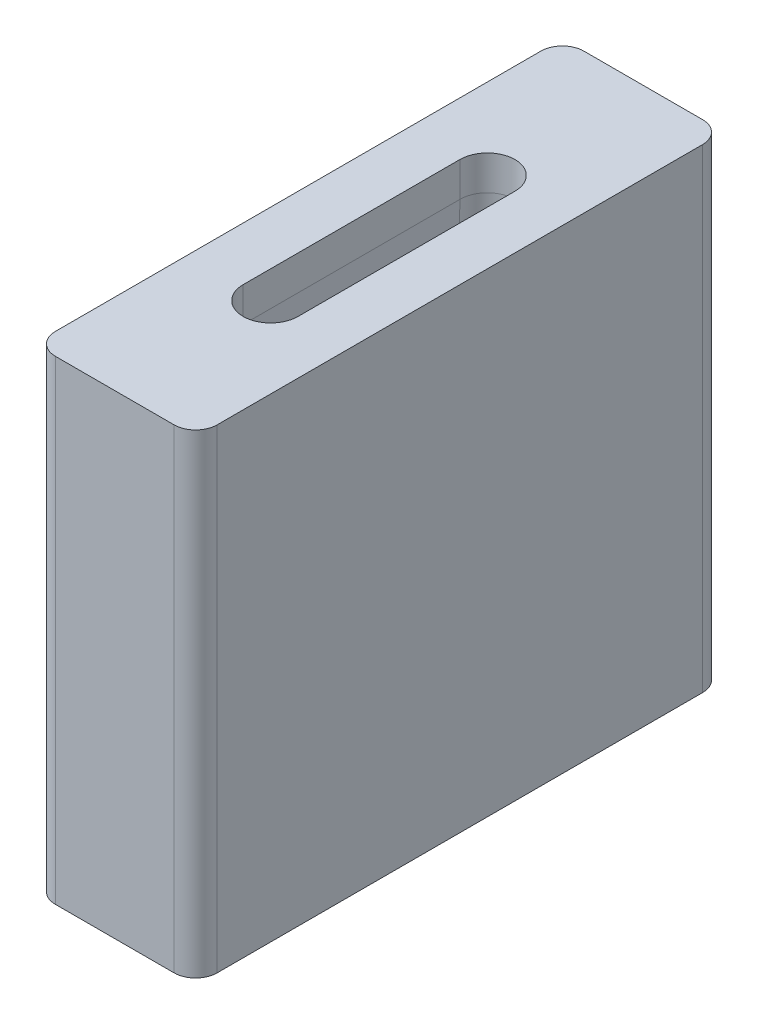
ISO-10303-21;
HEADER;
FILE_DESCRIPTION(('STEP AP214'),'2;1');
FILE_NAME('part.step','',(''),(''),'','','');
FILE_SCHEMA(('AUTOMOTIVE_DESIGN { 1 0 10303 214 1 1 1 1 }'));
ENDSEC;
DATA;
#1=APPLICATION_CONTEXT('core data for automotive mechanical design processes');
#2=APPLICATION_PROTOCOL_DEFINITION('international standard','automotive_design',2000,#1);
#3=PRODUCT_CONTEXT('',#1,'mechanical');
#4=PRODUCT('Part','Part','',(#3));
#5=PRODUCT_RELATED_PRODUCT_CATEGORY('part','',(#4));
#6=PRODUCT_DEFINITION_FORMATION('','',#4);
#7=PRODUCT_DEFINITION_CONTEXT('part definition',#1,'design');
#8=PRODUCT_DEFINITION('design','',#6,#7);
#9=PRODUCT_DEFINITION_SHAPE('','',#8);
#10=(LENGTH_UNIT() NAMED_UNIT(*) SI_UNIT(.MILLI.,.METRE.));
#11=(NAMED_UNIT(*) PLANE_ANGLE_UNIT() SI_UNIT($,.RADIAN.));
#12=(NAMED_UNIT(*) SI_UNIT($,.STERADIAN.) SOLID_ANGLE_UNIT());
#13=UNCERTAINTY_MEASURE_WITH_UNIT(LENGTH_MEASURE(1.E-05),#10,'distance_accuracy_value','');
#14=(GEOMETRIC_REPRESENTATION_CONTEXT(3) GLOBAL_UNCERTAINTY_ASSIGNED_CONTEXT((#13)) GLOBAL_UNIT_ASSIGNED_CONTEXT((#10,
#11,#12)) REPRESENTATION_CONTEXT('',''));
#15=CARTESIAN_POINT('',(0.,0.,0.));
#16=DIRECTION('',(0.,0.,1.));
#17=DIRECTION('',(1.,0.,0.));
#18=AXIS2_PLACEMENT_3D('',#15,#16,#17);
#19=CARTESIAN_POINT('',(0.,-44.001,10.05));
#20=DIRECTION('',(0.,1.,0.));
#21=DIRECTION('',(0.,0.,1.));
#22=AXIS2_PLACEMENT_3D('',#19,#20,#21);
#23=CYLINDRICAL_SURFACE('',#22,2.55);
#24=CARTESIAN_POINT('',(0.,-3.2,10.05));
#25=DIRECTION('',(0.,1.,0.));
#26=DIRECTION('',(-1.,0.,0.));
#27=AXIS2_PLACEMENT_3D('',#24,#25,#26);
#28=CIRCLE('',#27,2.55);
#29=CARTESIAN_POINT('',(-2.55,-3.2,10.05));
#30=VERTEX_POINT('',#29);
#31=CARTESIAN_POINT('',(2.55,-3.20000000000076,10.05));
#32=VERTEX_POINT('',#31);
#33=EDGE_CURVE('E75',#30,#32,#28,.T.);
#34=ORIENTED_EDGE('',*,*,#33,.F.);
#35=DIRECTION('',(0.,1.,0.));
#36=VECTOR('',#35,1.);
#37=CARTESIAN_POINT('',(-2.55,-44.001,10.05));
#38=LINE('',#37,#36);
#39=CARTESIAN_POINT('',(-2.55,0.,10.05));
#40=VERTEX_POINT('',#39);
#41=EDGE_CURVE('E238',#30,#40,#38,.T.);
#42=ORIENTED_EDGE('',*,*,#41,.T.);
#43=CARTESIAN_POINT('',(0.,0.,10.05));
#44=DIRECTION('',(0.,1.,0.));
#45=DIRECTION('',(0.,0.,1.));
#46=AXIS2_PLACEMENT_3D('',#43,#44,#45);
#47=CIRCLE('',#46,2.55);
#48=CARTESIAN_POINT('',(2.55,0.,10.05));
#49=VERTEX_POINT('',#48);
#50=EDGE_CURVE('E224',#40,#49,#47,.T.);
#51=ORIENTED_EDGE('',*,*,#50,.T.);
#52=DIRECTION('',(0.,1.,0.));
#53=VECTOR('',#52,1.);
#54=CARTESIAN_POINT('',(2.55,-44.001,10.05));
#55=LINE('',#54,#53);
#56=EDGE_CURVE('E237',#32,#49,#55,.T.);
#57=ORIENTED_EDGE('',*,*,#56,.F.);
#58=EDGE_LOOP('',(#34,#42,#51,#57));
#59=FACE_BOUND('',#58,.T.);
#60=ADVANCED_FACE('F51',(#59),#23,.F.);
#61=CARTESIAN_POINT('',(-2.55,-44.001,10.05));
#62=DIRECTION('',(-1.,0.,0.));
#63=DIRECTION('',(0.,0.,1.));
#64=AXIS2_PLACEMENT_3D('',#61,#62,#63);
#65=PLANE('',#64);
#66=DIRECTION('',(0.,0.,1.));
#67=VECTOR('',#66,1.);
#68=CARTESIAN_POINT('',(-2.55000000000001,-3.2,-10.05));
#69=LINE('',#68,#67);
#70=CARTESIAN_POINT('',(-2.55000000000001,-3.2,-10.05));
#71=VERTEX_POINT('',#70);
#72=EDGE_CURVE('E212',#71,#30,#69,.T.);
#73=ORIENTED_EDGE('',*,*,#72,.F.);
#74=DIRECTION('',(0.,1.,0.));
#75=VECTOR('',#74,1.);
#76=CARTESIAN_POINT('',(-2.55,-44.001,-10.05));
#77=LINE('',#76,#75);
#78=CARTESIAN_POINT('',(-2.55,0.,-10.05));
#79=VERTEX_POINT('',#78);
#80=EDGE_CURVE('E241',#71,#79,#77,.T.);
#81=ORIENTED_EDGE('',*,*,#80,.T.);
#82=DIRECTION('',(0.,0.,1.));
#83=VECTOR('',#82,1.);
#84=CARTESIAN_POINT('',(-2.55,0.,10.05));
#85=LINE('',#84,#83);
#86=EDGE_CURVE('E234',#79,#40,#85,.T.);
#87=ORIENTED_EDGE('',*,*,#86,.T.);
#88=ORIENTED_EDGE('',*,*,#41,.F.);
#89=EDGE_LOOP('',(#73,#81,#87,#88));
#90=FACE_BOUND('',#89,.T.);
#91=ADVANCED_FACE('F346',(#90),#65,.F.);
#92=CARTESIAN_POINT('',(0.,-44.001,-10.05));
#93=DIRECTION('',(0.,1.,0.));
#94=DIRECTION('',(0.,0.,1.));
#95=AXIS2_PLACEMENT_3D('',#92,#93,#94);
#96=CYLINDRICAL_SURFACE('',#95,2.55);
#97=CARTESIAN_POINT('',(0.,-3.2,-10.05));
#98=DIRECTION('',(0.,1.,0.));
#99=DIRECTION('',(1.,0.,0.));
#100=AXIS2_PLACEMENT_3D('',#97,#98,#99);
#101=CIRCLE('',#100,2.55);
#102=CARTESIAN_POINT('',(2.55,-3.2,-10.05));
#103=VERTEX_POINT('',#102);
#104=EDGE_CURVE('E204',#103,#71,#101,.T.);
#105=ORIENTED_EDGE('',*,*,#104,.F.);
#106=DIRECTION('',(0.,1.,0.));
#107=VECTOR('',#106,1.);
#108=CARTESIAN_POINT('',(2.55,-44.001,-10.05));
#109=LINE('',#108,#107);
#110=CARTESIAN_POINT('',(2.55,0.,-10.05));
#111=VERTEX_POINT('',#110);
#112=EDGE_CURVE('E243',#103,#111,#109,.T.);
#113=ORIENTED_EDGE('',*,*,#112,.T.);
#114=CARTESIAN_POINT('',(0.,0.,-10.05));
#115=DIRECTION('',(0.,1.,0.));
#116=DIRECTION('',(0.,0.,1.));
#117=AXIS2_PLACEMENT_3D('',#114,#115,#116);
#118=CIRCLE('',#117,2.55);
#119=EDGE_CURVE('E231',#111,#79,#118,.T.);
#120=ORIENTED_EDGE('',*,*,#119,.T.);
#121=ORIENTED_EDGE('',*,*,#80,.F.);
#122=EDGE_LOOP('',(#105,#113,#120,#121));
#123=FACE_BOUND('',#122,.T.);
#124=ADVANCED_FACE('F353',(#123),#96,.F.);
#125=CARTESIAN_POINT('',(2.55,-44.001,10.05));
#126=DIRECTION('',(1.,0.,0.));
#127=DIRECTION('',(0.,0.,-1.));
#128=AXIS2_PLACEMENT_3D('',#125,#126,#127);
#129=PLANE('',#128);
#130=DIRECTION('',(0.,0.,-1.));
#131=VECTOR('',#130,1.);
#132=CARTESIAN_POINT('',(2.55,-3.2,0.));
#133=LINE('',#132,#131);
#134=CARTESIAN_POINT('',(2.55,-3.2,0.));
#135=VERTEX_POINT('',#134);
#136=EDGE_CURVE('E196',#135,#103,#133,.T.);
#137=ORIENTED_EDGE('',*,*,#136,.F.);
#138=DIRECTION('',(0.,0.,-1.));
#139=VECTOR('',#138,1.);
#140=CARTESIAN_POINT('',(2.55,-3.2,10.05));
#141=LINE('',#140,#139);
#142=EDGE_CURVE('E221',#32,#135,#141,.T.);
#143=ORIENTED_EDGE('',*,*,#142,.F.);
#144=ORIENTED_EDGE('',*,*,#56,.T.);
#145=DIRECTION('',(0.,0.,-1.));
#146=VECTOR('',#145,1.);
#147=CARTESIAN_POINT('',(2.55,0.,10.05));
#148=LINE('',#147,#146);
#149=EDGE_CURVE('E228',#49,#111,#148,.T.);
#150=ORIENTED_EDGE('',*,*,#149,.T.);
#151=ORIENTED_EDGE('',*,*,#112,.F.);
#152=EDGE_LOOP('',(#137,#143,#144,#150,#151));
#153=FACE_BOUND('',#152,.T.);
#154=ADVANCED_FACE('F358',(#153),#129,.F.);
#155=CARTESIAN_POINT('',(-5.5,-44.,22.5));
#156=DIRECTION('',(0.,1.,0.));
#157=DIRECTION('',(0.,0.,1.));
#158=AXIS2_PLACEMENT_3D('',#155,#156,#157);
#159=CYLINDRICAL_SURFACE('',#158,2.);
#160=CARTESIAN_POINT('',(-5.5,0.,22.5));
#161=DIRECTION('',(0.,1.,0.));
#162=DIRECTION('',(0.,0.,-1.));
#163=AXIS2_PLACEMENT_3D('',#160,#161,#162);
#164=CIRCLE('',#163,2.);
#165=CARTESIAN_POINT('',(-7.5,0.,22.5));
#166=VERTEX_POINT('',#165);
#167=CARTESIAN_POINT('',(-5.5,0.,24.5));
#168=VERTEX_POINT('',#167);
#169=EDGE_CURVE('E240',#166,#168,#164,.T.);
#170=ORIENTED_EDGE('',*,*,#169,.F.);
#171=DIRECTION('',(0.,1.,0.));
#172=VECTOR('',#171,1.);
#173=CARTESIAN_POINT('',(-7.5,-44.,22.5));
#174=LINE('',#173,#172);
#175=CARTESIAN_POINT('',(-7.5,-44.,22.5));
#176=VERTEX_POINT('',#175);
#177=EDGE_CURVE('E11',#176,#166,#174,.T.);
#178=ORIENTED_EDGE('',*,*,#177,.F.);
#179=CARTESIAN_POINT('',(-5.5,-44.,22.5));
#180=DIRECTION('',(0.,1.,0.));
#181=DIRECTION('',(0.,0.,-1.));
#182=AXIS2_PLACEMENT_3D('',#179,#180,#181);
#183=CIRCLE('',#182,2.);
#184=CARTESIAN_POINT('',(-5.5,-44.,24.5));
#185=VERTEX_POINT('',#184);
#186=EDGE_CURVE('E246',#176,#185,#183,.T.);
#187=ORIENTED_EDGE('',*,*,#186,.T.);
#188=DIRECTION('',(0.,1.,0.));
#189=VECTOR('',#188,1.);
#190=CARTESIAN_POINT('',(-5.5,-44.,24.5));
#191=LINE('',#190,#189);
#192=EDGE_CURVE('E55',#185,#168,#191,.T.);
#193=ORIENTED_EDGE('',*,*,#192,.T.);
#194=EDGE_LOOP('',(#170,#178,#187,#193));
#195=FACE_BOUND('',#194,.T.);
#196=ADVANCED_FACE('F53',(#195),#159,.T.);
#197=CARTESIAN_POINT('',(-7.5,-44.,22.5));
#198=DIRECTION('',(-1.,0.,0.));
#199=DIRECTION('',(0.,0.,1.));
#200=AXIS2_PLACEMENT_3D('',#197,#198,#199);
#201=PLANE('',#200);
#202=DIRECTION('',(0.,0.,1.));
#203=VECTOR('',#202,1.);
#204=CARTESIAN_POINT('',(-7.5,0.,22.5));
#205=LINE('',#204,#203);
#206=CARTESIAN_POINT('',(-7.5,0.,-22.5));
#207=VERTEX_POINT('',#206);
#208=EDGE_CURVE('E250',#207,#166,#205,.T.);
#209=ORIENTED_EDGE('',*,*,#208,.F.);
#210=DIRECTION('',(0.,1.,0.));
#211=VECTOR('',#210,1.);
#212=CARTESIAN_POINT('',(-7.5,-44.,-22.5));
#213=LINE('',#212,#211);
#214=CARTESIAN_POINT('',(-7.5,-44.,-22.5));
#215=VERTEX_POINT('',#214);
#216=EDGE_CURVE('E60',#215,#207,#213,.T.);
#217=ORIENTED_EDGE('',*,*,#216,.F.);
#218=DIRECTION('',(0.,0.,1.));
#219=VECTOR('',#218,1.);
#220=CARTESIAN_POINT('',(-7.5,-44.,22.5));
#221=LINE('',#220,#219);
#222=EDGE_CURVE('E268',#215,#176,#221,.T.);
#223=ORIENTED_EDGE('',*,*,#222,.T.);
#224=ORIENTED_EDGE('',*,*,#177,.T.);
#225=EDGE_LOOP('',(#209,#217,#223,#224));
#226=FACE_BOUND('',#225,.T.);
#227=ADVANCED_FACE('F315',(#226),#201,.T.);
#228=CARTESIAN_POINT('',(-5.5,-44.,-22.5));
#229=DIRECTION('',(0.,1.,0.));
#230=DIRECTION('',(0.,0.,1.));
#231=AXIS2_PLACEMENT_3D('',#228,#229,#230);
#232=CYLINDRICAL_SURFACE('',#231,2.);
#233=CARTESIAN_POINT('',(-5.5,0.,-22.5));
#234=DIRECTION('',(0.,1.,0.));
#235=DIRECTION('',(0.,0.,-1.));
#236=AXIS2_PLACEMENT_3D('',#233,#234,#235);
#237=CIRCLE('',#236,2.);
#238=CARTESIAN_POINT('',(-5.5,0.,-24.5));
#239=VERTEX_POINT('',#238);
#240=EDGE_CURVE('E288',#239,#207,#237,.T.);
#241=ORIENTED_EDGE('',*,*,#240,.F.);
#242=DIRECTION('',(0.,1.,0.));
#243=VECTOR('',#242,1.);
#244=CARTESIAN_POINT('',(-5.5,-44.,-24.5));
#245=LINE('',#244,#243);
#246=CARTESIAN_POINT('',(-5.5,-44.,-24.5));
#247=VERTEX_POINT('',#246);
#248=EDGE_CURVE('E294',#247,#239,#245,.T.);
#249=ORIENTED_EDGE('',*,*,#248,.F.);
#250=CARTESIAN_POINT('',(-5.5,-44.,-22.5));
#251=DIRECTION('',(0.,1.,0.));
#252=DIRECTION('',(0.,0.,-1.));
#253=AXIS2_PLACEMENT_3D('',#250,#251,#252);
#254=CIRCLE('',#253,2.);
#255=EDGE_CURVE('E265',#247,#215,#254,.T.);
#256=ORIENTED_EDGE('',*,*,#255,.T.);
#257=ORIENTED_EDGE('',*,*,#216,.T.);
#258=EDGE_LOOP('',(#241,#249,#256,#257));
#259=FACE_BOUND('',#258,.T.);
#260=ADVANCED_FACE('F336',(#259),#232,.T.);
#261=CARTESIAN_POINT('',(-5.5,-44.,-24.5));
#262=DIRECTION('',(0.,0.,-1.));
#263=DIRECTION('',(-1.,0.,0.));
#264=AXIS2_PLACEMENT_3D('',#261,#262,#263);
#265=PLANE('',#264);
#266=DIRECTION('',(-1.,0.,0.));
#267=VECTOR('',#266,1.);
#268=CARTESIAN_POINT('',(-5.5,0.,-24.5));
#269=LINE('',#268,#267);
#270=CARTESIAN_POINT('',(5.5,0.,-24.5));
#271=VERTEX_POINT('',#270);
#272=EDGE_CURVE('E285',#271,#239,#269,.T.);
#273=ORIENTED_EDGE('',*,*,#272,.F.);
#274=DIRECTION('',(0.,1.,0.));
#275=VECTOR('',#274,1.);
#276=CARTESIAN_POINT('',(5.5,-44.,-24.5));
#277=LINE('',#276,#275);
#278=CARTESIAN_POINT('',(5.5,-44.,-24.5));
#279=VERTEX_POINT('',#278);
#280=EDGE_CURVE('E296',#279,#271,#277,.T.);
#281=ORIENTED_EDGE('',*,*,#280,.F.);
#282=DIRECTION('',(-1.,0.,0.));
#283=VECTOR('',#282,1.);
#284=CARTESIAN_POINT('',(-5.5,-44.,-24.5));
#285=LINE('',#284,#283);
#286=EDGE_CURVE('E262',#279,#247,#285,.T.);
#287=ORIENTED_EDGE('',*,*,#286,.T.);
#288=ORIENTED_EDGE('',*,*,#248,.T.);
#289=EDGE_LOOP('',(#273,#281,#287,#288));
#290=FACE_BOUND('',#289,.T.);
#291=ADVANCED_FACE('F334',(#290),#265,.T.);
#292=CARTESIAN_POINT('',(5.5,-44.,-22.5));
#293=DIRECTION('',(0.,1.,0.));
#294=DIRECTION('',(0.,0.,1.));
#295=AXIS2_PLACEMENT_3D('',#292,#293,#294);
#296=CYLINDRICAL_SURFACE('',#295,2.);
#297=CARTESIAN_POINT('',(5.5,0.,-22.5));
#298=DIRECTION('',(0.,1.,0.));
#299=DIRECTION('',(0.,0.,-1.));
#300=AXIS2_PLACEMENT_3D('',#297,#298,#299);
#301=CIRCLE('',#300,2.);
#302=CARTESIAN_POINT('',(7.5,0.,-22.5));
#303=VERTEX_POINT('',#302);
#304=EDGE_CURVE('E282',#303,#271,#301,.T.);
#305=ORIENTED_EDGE('',*,*,#304,.F.);
#306=DIRECTION('',(0.,1.,0.));
#307=VECTOR('',#306,1.);
#308=CARTESIAN_POINT('',(7.5,-44.,-22.5));
#309=LINE('',#308,#307);
#310=CARTESIAN_POINT('',(7.5,-44.,-22.5));
#311=VERTEX_POINT('',#310);
#312=EDGE_CURVE('E298',#311,#303,#309,.T.);
#313=ORIENTED_EDGE('',*,*,#312,.F.);
#314=CARTESIAN_POINT('',(5.5,-44.,-22.5));
#315=DIRECTION('',(0.,1.,0.));
#316=DIRECTION('',(0.,0.,-1.));
#317=AXIS2_PLACEMENT_3D('',#314,#315,#316);
#318=CIRCLE('',#317,2.);
#319=EDGE_CURVE('E259',#311,#279,#318,.T.);
#320=ORIENTED_EDGE('',*,*,#319,.T.);
#321=ORIENTED_EDGE('',*,*,#280,.T.);
#322=EDGE_LOOP('',(#305,#313,#320,#321));
#323=FACE_BOUND('',#322,.T.);
#324=ADVANCED_FACE('F330',(#323),#296,.T.);
#325=CARTESIAN_POINT('',(7.5,-44.,22.5));
#326=DIRECTION('',(1.,0.,0.));
#327=DIRECTION('',(0.,0.,-1.));
#328=AXIS2_PLACEMENT_3D('',#325,#326,#327);
#329=PLANE('',#328);
#330=DIRECTION('',(0.,0.,-1.));
#331=VECTOR('',#330,1.);
#332=CARTESIAN_POINT('',(7.5,0.,22.5));
#333=LINE('',#332,#331);
#334=CARTESIAN_POINT('',(7.5,0.,22.5));
#335=VERTEX_POINT('',#334);
#336=EDGE_CURVE('E279',#335,#303,#333,.T.);
#337=ORIENTED_EDGE('',*,*,#336,.F.);
#338=DIRECTION('',(0.,1.,0.));
#339=VECTOR('',#338,1.);
#340=CARTESIAN_POINT('',(7.5,-44.,22.5));
#341=LINE('',#340,#339);
#342=CARTESIAN_POINT('',(7.5,-44.,22.5));
#343=VERTEX_POINT('',#342);
#344=EDGE_CURVE('E300',#343,#335,#341,.T.);
#345=ORIENTED_EDGE('',*,*,#344,.F.);
#346=DIRECTION('',(0.,0.,-1.));
#347=VECTOR('',#346,1.);
#348=CARTESIAN_POINT('',(7.5,-44.,22.5));
#349=LINE('',#348,#347);
#350=EDGE_CURVE('E256',#343,#311,#349,.T.);
#351=ORIENTED_EDGE('',*,*,#350,.T.);
#352=ORIENTED_EDGE('',*,*,#312,.T.);
#353=EDGE_LOOP('',(#337,#345,#351,#352));
#354=FACE_BOUND('',#353,.T.);
#355=ADVANCED_FACE('F328',(#354),#329,.T.);
#356=CARTESIAN_POINT('',(5.5,-44.,22.5));
#357=DIRECTION('',(0.,1.,0.));
#358=DIRECTION('',(0.,0.,1.));
#359=AXIS2_PLACEMENT_3D('',#356,#357,#358);
#360=CYLINDRICAL_SURFACE('',#359,2.);
#361=CARTESIAN_POINT('',(5.5,0.,22.5));
#362=DIRECTION('',(0.,1.,0.));
#363=DIRECTION('',(0.,0.,1.));
#364=AXIS2_PLACEMENT_3D('',#361,#362,#363);
#365=CIRCLE('',#364,2.);
#366=CARTESIAN_POINT('',(5.5,0.,24.5));
#367=VERTEX_POINT('',#366);
#368=EDGE_CURVE('E276',#367,#335,#365,.T.);
#369=ORIENTED_EDGE('',*,*,#368,.F.);
#370=DIRECTION('',(0.,1.,0.));
#371=VECTOR('',#370,1.);
#372=CARTESIAN_POINT('',(5.5,-44.,24.5));
#373=LINE('',#372,#371);
#374=CARTESIAN_POINT('',(5.5,-44.,24.5));
#375=VERTEX_POINT('',#374);
#376=EDGE_CURVE('E301',#375,#367,#373,.T.);
#377=ORIENTED_EDGE('',*,*,#376,.F.);
#378=CARTESIAN_POINT('',(5.5,-44.,22.5));
#379=DIRECTION('',(0.,1.,0.));
#380=DIRECTION('',(0.,0.,1.));
#381=AXIS2_PLACEMENT_3D('',#378,#379,#380);
#382=CIRCLE('',#381,2.);
#383=EDGE_CURVE('E253',#375,#343,#382,.T.);
#384=ORIENTED_EDGE('',*,*,#383,.T.);
#385=ORIENTED_EDGE('',*,*,#344,.T.);
#386=EDGE_LOOP('',(#369,#377,#384,#385));
#387=FACE_BOUND('',#386,.T.);
#388=ADVANCED_FACE('F324',(#387),#360,.T.);
#389=CARTESIAN_POINT('',(-5.5,-44.,24.5));
#390=DIRECTION('',(0.,0.,1.));
#391=DIRECTION('',(1.,0.,0.));
#392=AXIS2_PLACEMENT_3D('',#389,#390,#391);
#393=PLANE('',#392);
#394=DIRECTION('',(1.,0.,0.));
#395=VECTOR('',#394,1.);
#396=CARTESIAN_POINT('',(-5.5,0.,24.5));
#397=LINE('',#396,#395);
#398=EDGE_CURVE('E273',#168,#367,#397,.T.);
#399=ORIENTED_EDGE('',*,*,#398,.F.);
#400=ORIENTED_EDGE('',*,*,#192,.F.);
#401=DIRECTION('',(1.,0.,0.));
#402=VECTOR('',#401,1.);
#403=CARTESIAN_POINT('',(-5.5,-44.,24.5));
#404=LINE('',#403,#402);
#405=EDGE_CURVE('E249',#185,#375,#404,.T.);
#406=ORIENTED_EDGE('',*,*,#405,.T.);
#407=ORIENTED_EDGE('',*,*,#376,.T.);
#408=EDGE_LOOP('',(#399,#400,#406,#407));
#409=FACE_BOUND('',#408,.T.);
#410=ADVANCED_FACE('F309',(#409),#393,.T.);
#411=CARTESIAN_POINT('',(-5.5,-44.,22.5));
#412=DIRECTION('',(0.,-1.,0.));
#413=DIRECTION('',(0.,0.,-1.));
#414=AXIS2_PLACEMENT_3D('',#411,#412,#413);
#415=PLANE('',#414);
#416=CARTESIAN_POINT('',(0.,-44.,-20.5));
#417=DIRECTION('',(0.,-1.,0.));
#418=DIRECTION('',(0.,0.,-1.));
#419=AXIS2_PLACEMENT_3D('',#416,#417,#418);
#420=CIRCLE('',#419,3.025);
#421=CARTESIAN_POINT('',(0.,-44.,-23.525));
#422=VERTEX_POINT('',#421);
#423=EDGE_CURVE('E181',#422,#422,#420,.T.);
#424=ORIENTED_EDGE('',*,*,#423,.F.);
#425=EDGE_LOOP('',(#424));
#426=FACE_BOUND('',#425,.T.);
#427=CARTESIAN_POINT('',(0.,-44.,20.5));
#428=DIRECTION('',(0.,-1.,0.));
#429=DIRECTION('',(0.,0.,-1.));
#430=AXIS2_PLACEMENT_3D('',#427,#428,#429);
#431=CIRCLE('',#430,3.025);
#432=CARTESIAN_POINT('',(0.,-44.,17.475));
#433=VERTEX_POINT('',#432);
#434=EDGE_CURVE('E174',#433,#433,#431,.T.);
#435=ORIENTED_EDGE('',*,*,#434,.F.);
#436=EDGE_LOOP('',(#435));
#437=FACE_BOUND('',#436,.T.);
#438=CARTESIAN_POINT('',(0.,-44.,10.05));
#439=DIRECTION('',(0.,1.,0.));
#440=DIRECTION('',(-1.,0.,0.));
#441=AXIS2_PLACEMENT_3D('',#438,#439,#440);
#442=CIRCLE('',#441,3.262166649071);
#443=CARTESIAN_POINT('',(-3.262166649071,-44.,10.05));
#444=VERTEX_POINT('',#443);
#445=CARTESIAN_POINT('',(3.262166649071,-44.,10.05));
#446=VERTEX_POINT('',#445);
#447=EDGE_CURVE('E211',#444,#446,#442,.T.);
#448=ORIENTED_EDGE('',*,*,#447,.T.);
#449=DIRECTION('',(0.,0.,-1.));
#450=VECTOR('',#449,1.);
#451=CARTESIAN_POINT('',(3.262166649071,-44.,10.05));
#452=LINE('',#451,#450);
#453=CARTESIAN_POINT('',(3.262166649071,-44.,0.));
#454=VERTEX_POINT('',#453);
#455=EDGE_CURVE('E68',#446,#454,#452,.T.);
#456=ORIENTED_EDGE('',*,*,#455,.T.);
#457=DIRECTION('',(0.,0.,-1.));
#458=VECTOR('',#457,1.);
#459=CARTESIAN_POINT('',(3.262166649071,-44.,0.));
#460=LINE('',#459,#458);
#461=CARTESIAN_POINT('',(3.262166649071,-44.,-10.05));
#462=VERTEX_POINT('',#461);
#463=EDGE_CURVE('E192',#454,#462,#460,.T.);
#464=ORIENTED_EDGE('',*,*,#463,.T.);
#465=CARTESIAN_POINT('',(0.,-44.,-10.05));
#466=DIRECTION('',(0.,1.,0.));
#467=DIRECTION('',(1.,0.,0.));
#468=AXIS2_PLACEMENT_3D('',#465,#466,#467);
#469=CIRCLE('',#468,3.262166649071);
#470=CARTESIAN_POINT('',(-3.26216664907101,-44.,-10.05));
#471=VERTEX_POINT('',#470);
#472=EDGE_CURVE('E198',#462,#471,#469,.T.);
#473=ORIENTED_EDGE('',*,*,#472,.T.);
#474=DIRECTION('',(0.,0.,1.));
#475=VECTOR('',#474,1.);
#476=CARTESIAN_POINT('',(-3.26216664907101,-44.,-10.05));
#477=LINE('',#476,#475);
#478=EDGE_CURVE('E206',#471,#444,#477,.T.);
#479=ORIENTED_EDGE('',*,*,#478,.T.);
#480=EDGE_LOOP('',(#448,#456,#464,#473,#479));
#481=FACE_BOUND('',#480,.T.);
#482=ORIENTED_EDGE('',*,*,#186,.F.);
#483=ORIENTED_EDGE('',*,*,#222,.F.);
#484=ORIENTED_EDGE('',*,*,#255,.F.);
#485=ORIENTED_EDGE('',*,*,#286,.F.);
#486=ORIENTED_EDGE('',*,*,#319,.F.);
#487=ORIENTED_EDGE('',*,*,#350,.F.);
#488=ORIENTED_EDGE('',*,*,#383,.F.);
#489=ORIENTED_EDGE('',*,*,#405,.F.);
#490=EDGE_LOOP('',(#482,#483,#484,#485,#486,#487,#488,#489));
#491=FACE_BOUND('',#490,.T.);
#492=ADVANCED_FACE('F318',(#426,#437,#481,#491),#415,.T.);
#493=CARTESIAN_POINT('',(-5.5,0.,22.5));
#494=DIRECTION('',(0.,-1.,0.));
#495=DIRECTION('',(0.,0.,-1.));
#496=AXIS2_PLACEMENT_3D('',#493,#494,#495);
#497=PLANE('',#496);
#498=ORIENTED_EDGE('',*,*,#149,.F.);
#499=ORIENTED_EDGE('',*,*,#50,.F.);
#500=ORIENTED_EDGE('',*,*,#86,.F.);
#501=ORIENTED_EDGE('',*,*,#119,.F.);
#502=EDGE_LOOP('',(#498,#499,#500,#501));
#503=FACE_BOUND('',#502,.T.);
#504=ORIENTED_EDGE('',*,*,#169,.T.);
#505=ORIENTED_EDGE('',*,*,#398,.T.);
#506=ORIENTED_EDGE('',*,*,#368,.T.);
#507=ORIENTED_EDGE('',*,*,#336,.T.);
#508=ORIENTED_EDGE('',*,*,#304,.T.);
#509=ORIENTED_EDGE('',*,*,#272,.T.);
#510=ORIENTED_EDGE('',*,*,#240,.T.);
#511=ORIENTED_EDGE('',*,*,#208,.T.);
#512=EDGE_LOOP('',(#504,#505,#506,#507,#508,#509,#510,#511));
#513=FACE_BOUND('',#512,.T.);
#514=ADVANCED_FACE('F311',(#503,#513),#497,.F.);
#515=CARTESIAN_POINT('',(2.55,-3.2,10.05));
#516=DIRECTION('',(-0.999847695156391,-0.0174524064372767,0.));
#517=DIRECTION('',(0.0174524064372767,-0.999847695156391,0.));
#518=AXIS2_PLACEMENT_3D('',#515,#516,#517);
#519=PLANE('',#518);
#520=DIRECTION('',(-0.0174524064372767,0.999847695156391,0.));
#521=VECTOR('',#520,1.);
#522=CARTESIAN_POINT('',(2.55,-3.2,10.05));
#523=LINE('',#522,#521);
#524=EDGE_CURVE('E216',#446,#32,#523,.T.);
#525=ORIENTED_EDGE('',*,*,#524,.T.);
#526=ORIENTED_EDGE('',*,*,#142,.T.);
#527=DIRECTION('',(-0.0174524064372767,0.999847695156391,0.));
#528=VECTOR('',#527,1.);
#529=CARTESIAN_POINT('',(2.55,-3.2,0.));
#530=LINE('',#529,#528);
#531=EDGE_CURVE('E190',#454,#135,#530,.T.);
#532=ORIENTED_EDGE('',*,*,#531,.F.);
#533=ORIENTED_EDGE('',*,*,#455,.F.);
#534=EDGE_LOOP('',(#525,#526,#532,#533));
#535=FACE_BOUND('',#534,.T.);
#536=ADVANCED_FACE('F363',(#535),#519,.T.);
#537=CARTESIAN_POINT('',(2.55,-3.2,0.));
#538=DIRECTION('',(-0.999847695156391,-0.0174524064372767,0.));
#539=DIRECTION('',(0.0174524064372767,-0.999847695156391,0.));
#540=AXIS2_PLACEMENT_3D('',#537,#538,#539);
#541=PLANE('',#540);
#542=ORIENTED_EDGE('',*,*,#136,.T.);
#543=DIRECTION('',(-0.0174524064372767,0.999847695156391,0.));
#544=VECTOR('',#543,1.);
#545=CARTESIAN_POINT('',(2.55,-3.2,-10.05));
#546=LINE('',#545,#544);
#547=EDGE_CURVE('E193',#462,#103,#546,.T.);
#548=ORIENTED_EDGE('',*,*,#547,.F.);
#549=ORIENTED_EDGE('',*,*,#463,.F.);
#550=ORIENTED_EDGE('',*,*,#531,.T.);
#551=EDGE_LOOP('',(#542,#548,#549,#550));
#552=FACE_BOUND('',#551,.T.);
#553=ADVANCED_FACE('F369',(#552),#541,.T.);
#554=CARTESIAN_POINT('',(0.,-44.,-10.05));
#555=DIRECTION('',(0.,-1.,0.));
#556=DIRECTION('',(0.,0.,-1.));
#557=AXIS2_PLACEMENT_3D('',#554,#555,#556);
#558=CONICAL_SURFACE('',#557,3.262166649071,0.0174532925199365);
#559=ORIENTED_EDGE('',*,*,#104,.T.);
#560=DIRECTION('',(0.0174524064372767,0.999847695156391,0.));
#561=VECTOR('',#560,1.);
#562=CARTESIAN_POINT('',(-2.55000000000001,-3.2,-10.05));
#563=LINE('',#562,#561);
#564=EDGE_CURVE('E201',#471,#71,#563,.T.);
#565=ORIENTED_EDGE('',*,*,#564,.F.);
#566=ORIENTED_EDGE('',*,*,#472,.F.);
#567=ORIENTED_EDGE('',*,*,#547,.T.);
#568=EDGE_LOOP('',(#559,#565,#566,#567));
#569=FACE_BOUND('',#568,.T.);
#570=ADVANCED_FACE('F386',(#569),#558,.F.);
#571=CARTESIAN_POINT('',(-2.55000000000001,-3.2,-10.05));
#572=DIRECTION('',(0.999847695156391,-0.0174524064372767,0.));
#573=DIRECTION('',(0.0174524064372767,0.999847695156391,0.));
#574=AXIS2_PLACEMENT_3D('',#571,#572,#573);
#575=PLANE('',#574);
#576=ORIENTED_EDGE('',*,*,#72,.T.);
#577=DIRECTION('',(0.0174524064372767,0.999847695156391,0.));
#578=VECTOR('',#577,1.);
#579=CARTESIAN_POINT('',(-2.55,-3.2,10.05));
#580=LINE('',#579,#578);
#581=EDGE_CURVE('E209',#444,#30,#580,.T.);
#582=ORIENTED_EDGE('',*,*,#581,.F.);
#583=ORIENTED_EDGE('',*,*,#478,.F.);
#584=ORIENTED_EDGE('',*,*,#564,.T.);
#585=EDGE_LOOP('',(#576,#582,#583,#584));
#586=FACE_BOUND('',#585,.T.);
#587=ADVANCED_FACE('F390',(#586),#575,.T.);
#588=CARTESIAN_POINT('',(0.,-44.,10.05));
#589=DIRECTION('',(0.,-1.,0.));
#590=DIRECTION('',(0.,0.,-1.));
#591=AXIS2_PLACEMENT_3D('',#588,#589,#590);
#592=CONICAL_SURFACE('',#591,3.262166649071,0.0174532925199365);
#593=ORIENTED_EDGE('',*,*,#33,.T.);
#594=ORIENTED_EDGE('',*,*,#524,.F.);
#595=ORIENTED_EDGE('',*,*,#447,.F.);
#596=ORIENTED_EDGE('',*,*,#581,.T.);
#597=EDGE_LOOP('',(#593,#594,#595,#596));
#598=FACE_BOUND('',#597,.T.);
#599=ADVANCED_FACE('F395',(#598),#592,.F.);
#600=CARTESIAN_POINT('',(0.,-27.,20.5));
#601=DIRECTION('',(0.,-1.,0.));
#602=DIRECTION('',(0.,0.,-1.));
#603=AXIS2_PLACEMENT_3D('',#600,#601,#602);
#604=CONICAL_SURFACE('',#603,2.5,1.02974425867665);
#605=CARTESIAN_POINT('',(0.,-25.4978484524311,20.5));
#606=VERTEX_POINT('',#605);
#607=VERTEX_LOOP('',#606);
#608=FACE_BOUND('',#607,.T.);
#609=CARTESIAN_POINT('',(0.,-27.,20.5));
#610=DIRECTION('',(0.,-1.,0.));
#611=DIRECTION('',(0.,0.,-1.));
#612=AXIS2_PLACEMENT_3D('',#609,#610,#611);
#613=CIRCLE('',#612,2.5);
#614=CARTESIAN_POINT('',(0.,-27.,18.));
#615=VERTEX_POINT('',#614);
#616=EDGE_CURVE('E187',#615,#615,#613,.T.);
#617=ORIENTED_EDGE('',*,*,#616,.T.);
#618=EDGE_LOOP('',(#617));
#619=FACE_BOUND('',#618,.T.);
#620=ADVANCED_FACE('F397',(#608,#619),#604,.F.);
#621=CARTESIAN_POINT('',(0.,-44.,20.5));
#622=DIRECTION('',(0.,-1.,0.));
#623=DIRECTION('',(0.,0.,-1.));
#624=AXIS2_PLACEMENT_3D('',#621,#622,#623);
#625=CYLINDRICAL_SURFACE('',#624,2.5);
#626=ORIENTED_EDGE('',*,*,#616,.F.);
#627=EDGE_LOOP('',(#626));
#628=FACE_BOUND('',#627,.T.);
#629=CARTESIAN_POINT('',(0.,-43.475,20.5));
#630=DIRECTION('',(0.,-1.,0.));
#631=DIRECTION('',(0.,0.,-1.));
#632=AXIS2_PLACEMENT_3D('',#629,#630,#631);
#633=CIRCLE('',#632,2.5);
#634=CARTESIAN_POINT('',(0.,-43.475,18.));
#635=VERTEX_POINT('',#634);
#636=EDGE_CURVE('E178',#635,#635,#633,.T.);
#637=ORIENTED_EDGE('',*,*,#636,.T.);
#638=EDGE_LOOP('',(#637));
#639=FACE_BOUND('',#638,.T.);
#640=ADVANCED_FACE('F403',(#628,#639),#625,.F.);
#641=CARTESIAN_POINT('',(0.,-44.,20.5));
#642=DIRECTION('',(0.,-1.,0.));
#643=DIRECTION('',(0.,0.,-1.));
#644=AXIS2_PLACEMENT_3D('',#641,#642,#643);
#645=CONICAL_SURFACE('',#644,3.025,0.785398163397452);
#646=ORIENTED_EDGE('',*,*,#636,.F.);
#647=EDGE_LOOP('',(#646));
#648=FACE_BOUND('',#647,.T.);
#649=ORIENTED_EDGE('',*,*,#434,.T.);
#650=EDGE_LOOP('',(#649));
#651=FACE_BOUND('',#650,.T.);
#652=ADVANCED_FACE('F168',(#648,#651),#645,.F.);
#653=CARTESIAN_POINT('',(0.,-27.,-20.5));
#654=DIRECTION('',(0.,-1.,0.));
#655=DIRECTION('',(0.,0.,-1.));
#656=AXIS2_PLACEMENT_3D('',#653,#654,#655);
#657=CONICAL_SURFACE('',#656,2.5,1.02974425867665);
#658=CARTESIAN_POINT('',(0.,-25.4978484524311,-20.5));
#659=VERTEX_POINT('',#658);
#660=VERTEX_LOOP('',#659);
#661=FACE_BOUND('',#660,.T.);
#662=CARTESIAN_POINT('',(0.,-27.,-20.5));
#663=DIRECTION('',(0.,-1.,0.));
#664=DIRECTION('',(0.,0.,-1.));
#665=AXIS2_PLACEMENT_3D('',#662,#663,#664);
#666=CIRCLE('',#665,2.5);
#667=CARTESIAN_POINT('',(0.,-27.,-23.));
#668=VERTEX_POINT('',#667);
#669=EDGE_CURVE('E172',#668,#668,#666,.T.);
#670=ORIENTED_EDGE('',*,*,#669,.T.);
#671=EDGE_LOOP('',(#670));
#672=FACE_BOUND('',#671,.T.);
#673=ADVANCED_FACE('F164',(#661,#672),#657,.F.);
#674=CARTESIAN_POINT('',(0.,-44.,-20.5));
#675=DIRECTION('',(0.,-1.,0.));
#676=DIRECTION('',(0.,0.,-1.));
#677=AXIS2_PLACEMENT_3D('',#674,#675,#676);
#678=CYLINDRICAL_SURFACE('',#677,2.5);
#679=ORIENTED_EDGE('',*,*,#669,.F.);
#680=EDGE_LOOP('',(#679));
#681=FACE_BOUND('',#680,.T.);
#682=CARTESIAN_POINT('',(0.,-43.475,-20.5));
#683=DIRECTION('',(0.,-1.,0.));
#684=DIRECTION('',(0.,0.,-1.));
#685=AXIS2_PLACEMENT_3D('',#682,#683,#684);
#686=CIRCLE('',#685,2.5);
#687=CARTESIAN_POINT('',(0.,-43.475,-23.));
#688=VERTEX_POINT('',#687);
#689=EDGE_CURVE('E175',#688,#688,#686,.T.);
#690=ORIENTED_EDGE('',*,*,#689,.T.);
#691=EDGE_LOOP('',(#690));
#692=FACE_BOUND('',#691,.T.);
#693=ADVANCED_FACE('F167',(#681,#692),#678,.F.);
#694=CARTESIAN_POINT('',(0.,-44.,-20.5));
#695=DIRECTION('',(0.,-1.,0.));
#696=DIRECTION('',(0.,0.,-1.));
#697=AXIS2_PLACEMENT_3D('',#694,#695,#696);
#698=CONICAL_SURFACE('',#697,3.025,0.785398163397452);
#699=ORIENTED_EDGE('',*,*,#689,.F.);
#700=EDGE_LOOP('',(#699));
#701=FACE_BOUND('',#700,.T.);
#702=ORIENTED_EDGE('',*,*,#423,.T.);
#703=EDGE_LOOP('',(#702));
#704=FACE_BOUND('',#703,.T.);
#705=ADVANCED_FACE('F566',(#701,#704),#698,.F.);
#706=CLOSED_SHELL('',(#60,#91,#124,#154,#196,#227,#260,#291,#324,#355,#388,#410,#492,#514,#536,
#553,#570,#587,#599,#620,#640,#652,#673,#693,#705));
#707=MANIFOLD_SOLID_BREP('B2',#706);
#708=ADVANCED_BREP_SHAPE_REPRESENTATION('',(#18,#707),#14);
#709=SHAPE_DEFINITION_REPRESENTATION(#9,#708);
ENDSEC;
END-ISO-10303-21;
